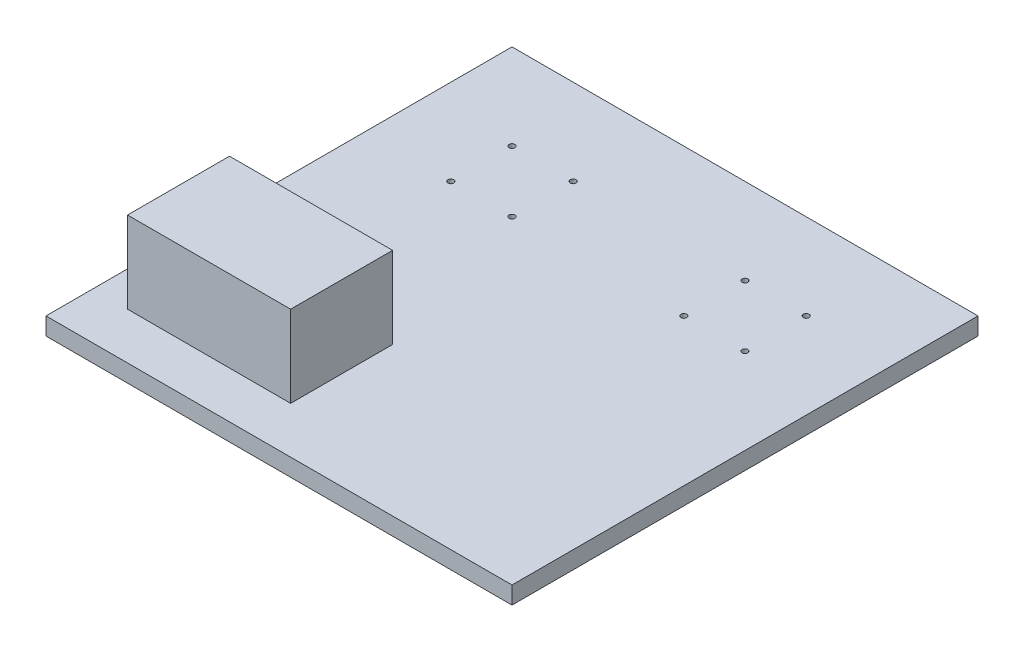
ISO-10303-21;
HEADER;
FILE_DESCRIPTION(('STEP AP214'),'2;1');
FILE_NAME('part.step','',(''),(''),'','','');
FILE_SCHEMA(('AUTOMOTIVE_DESIGN { 1 0 10303 214 1 1 1 1 }'));
ENDSEC;
DATA;
#1=APPLICATION_CONTEXT('core data for automotive mechanical design processes');
#2=APPLICATION_PROTOCOL_DEFINITION('international standard','automotive_design',2000,#1);
#3=PRODUCT_CONTEXT('',#1,'mechanical');
#4=PRODUCT('Part','Part','',(#3));
#5=PRODUCT_RELATED_PRODUCT_CATEGORY('part','',(#4));
#6=PRODUCT_DEFINITION_FORMATION('','',#4);
#7=PRODUCT_DEFINITION_CONTEXT('part definition',#1,'design');
#8=PRODUCT_DEFINITION('design','',#6,#7);
#9=PRODUCT_DEFINITION_SHAPE('','',#8);
#10=(LENGTH_UNIT() NAMED_UNIT(*) SI_UNIT(.MILLI.,.METRE.));
#11=(NAMED_UNIT(*) PLANE_ANGLE_UNIT() SI_UNIT($,.RADIAN.));
#12=(NAMED_UNIT(*) SI_UNIT($,.STERADIAN.) SOLID_ANGLE_UNIT());
#13=UNCERTAINTY_MEASURE_WITH_UNIT(LENGTH_MEASURE(1.E-05),#10,'distance_accuracy_value','');
#14=(GEOMETRIC_REPRESENTATION_CONTEXT(3) GLOBAL_UNCERTAINTY_ASSIGNED_CONTEXT((#13)) GLOBAL_UNIT_ASSIGNED_CONTEXT((#10,
#11,#12)) REPRESENTATION_CONTEXT('',''));
#15=CARTESIAN_POINT('',(0.,0.,0.));
#16=DIRECTION('',(0.,0.,1.));
#17=DIRECTION('',(1.,0.,0.));
#18=AXIS2_PLACEMENT_3D('',#15,#16,#17);
#19=CARTESIAN_POINT('',(0.,6.,0.));
#20=DIRECTION('',(0.,1.,0.));
#21=DIRECTION('',(0.,0.,1.));
#22=AXIS2_PLACEMENT_3D('',#19,#20,#21);
#23=PLANE('',#22);
#24=DIRECTION('',(-1.,0.,0.));
#25=VECTOR('',#24,1.);
#26=CARTESIAN_POINT('',(-40.,6.,120.));
#27=LINE('',#26,#25);
#28=CARTESIAN_POINT('',(120.,6.,120.));
#29=VERTEX_POINT('',#28);
#30=CARTESIAN_POINT('',(-40.,6.,120.));
#31=VERTEX_POINT('',#30);
#32=EDGE_CURVE('E196',#29,#31,#27,.T.);
#33=ORIENTED_EDGE('',*,*,#32,.F.);
#34=DIRECTION('',(0.,0.,1.));
#35=VECTOR('',#34,1.);
#36=CARTESIAN_POINT('',(120.,6.,-40.));
#37=LINE('',#36,#35);
#38=CARTESIAN_POINT('',(120.,6.,-40.));
#39=VERTEX_POINT('',#38);
#40=EDGE_CURVE('E229',#39,#29,#37,.T.);
#41=ORIENTED_EDGE('',*,*,#40,.F.);
#42=DIRECTION('',(-1.,0.,0.));
#43=VECTOR('',#42,1.);
#44=CARTESIAN_POINT('',(-40.,6.,-40.));
#45=LINE('',#44,#43);
#46=CARTESIAN_POINT('',(-40.,6.,-40.));
#47=VERTEX_POINT('',#46);
#48=EDGE_CURVE('E45',#39,#47,#45,.T.);
#49=ORIENTED_EDGE('',*,*,#48,.T.);
#50=DIRECTION('',(0.,0.,1.));
#51=VECTOR('',#50,1.);
#52=CARTESIAN_POINT('',(-40.,6.,-40.));
#53=LINE('',#52,#51);
#54=EDGE_CURVE('E260',#47,#31,#53,.T.);
#55=ORIENTED_EDGE('',*,*,#54,.T.);
#56=EDGE_LOOP('',(#33,#41,#49,#55));
#57=FACE_BOUND('',#56,.T.);
#58=CARTESIAN_POINT('',(90.4999999999998,6.,10.5));
#59=DIRECTION('',(0.,-1.,0.));
#60=DIRECTION('',(0.,0.,1.));
#61=AXIS2_PLACEMENT_3D('',#58,#59,#60);
#62=CIRCLE('',#61,0.999999999999999);
#63=CARTESIAN_POINT('',(90.4999999999998,6.,11.5));
#64=VERTEX_POINT('',#63);
#65=EDGE_CURVE('E204',#64,#64,#62,.T.);
#66=ORIENTED_EDGE('',*,*,#65,.T.);
#67=EDGE_LOOP('',(#66));
#68=FACE_BOUND('',#67,.T.);
#69=CARTESIAN_POINT('',(69.4999999999998,6.,10.5));
#70=DIRECTION('',(0.,-1.,0.));
#71=DIRECTION('',(0.,0.,1.));
#72=AXIS2_PLACEMENT_3D('',#69,#70,#71);
#73=CIRCLE('',#72,0.999999999999999);
#74=CARTESIAN_POINT('',(69.4999999999998,6.,11.5));
#75=VERTEX_POINT('',#74);
#76=EDGE_CURVE('E215',#75,#75,#73,.T.);
#77=ORIENTED_EDGE('',*,*,#76,.T.);
#78=EDGE_LOOP('',(#77));
#79=FACE_BOUND('',#78,.T.);
#80=CARTESIAN_POINT('',(69.5,6.,-10.5));
#81=DIRECTION('',(0.,-1.,0.));
#82=DIRECTION('',(0.,0.,1.));
#83=AXIS2_PLACEMENT_3D('',#80,#81,#82);
#84=CIRCLE('',#83,0.999999999999999);
#85=CARTESIAN_POINT('',(69.5,6.,-9.5));
#86=VERTEX_POINT('',#85);
#87=EDGE_CURVE('E209',#86,#86,#84,.T.);
#88=ORIENTED_EDGE('',*,*,#87,.T.);
#89=EDGE_LOOP('',(#88));
#90=FACE_BOUND('',#89,.T.);
#91=CARTESIAN_POINT('',(90.5,6.,-10.5));
#92=DIRECTION('',(0.,-1.,0.));
#93=DIRECTION('',(0.,0.,1.));
#94=AXIS2_PLACEMENT_3D('',#91,#92,#93);
#95=CIRCLE('',#94,0.999999999999999);
#96=CARTESIAN_POINT('',(90.5,6.,-9.5));
#97=VERTEX_POINT('',#96);
#98=EDGE_CURVE('E208',#97,#97,#95,.T.);
#99=ORIENTED_EDGE('',*,*,#98,.T.);
#100=EDGE_LOOP('',(#99));
#101=FACE_BOUND('',#100,.T.);
#102=CARTESIAN_POINT('',(-10.4999999999998,6.,10.5));
#103=DIRECTION('',(0.,1.,0.));
#104=DIRECTION('',(0.,0.,1.));
#105=AXIS2_PLACEMENT_3D('',#102,#103,#104);
#106=CIRCLE('',#105,0.999999999999999);
#107=CARTESIAN_POINT('',(-10.4999999999998,6.,11.5));
#108=VERTEX_POINT('',#107);
#109=EDGE_CURVE('E249',#108,#108,#106,.T.);
#110=ORIENTED_EDGE('',*,*,#109,.F.);
#111=EDGE_LOOP('',(#110));
#112=FACE_BOUND('',#111,.T.);
#113=CARTESIAN_POINT('',(10.5000000000002,6.,10.5));
#114=DIRECTION('',(0.,1.,0.));
#115=DIRECTION('',(0.,0.,1.));
#116=AXIS2_PLACEMENT_3D('',#113,#114,#115);
#117=CIRCLE('',#116,0.999999999999999);
#118=CARTESIAN_POINT('',(10.5000000000002,6.,11.5));
#119=VERTEX_POINT('',#118);
#120=EDGE_CURVE('E243',#119,#119,#117,.T.);
#121=ORIENTED_EDGE('',*,*,#120,.F.);
#122=EDGE_LOOP('',(#121));
#123=FACE_BOUND('',#122,.T.);
#124=CARTESIAN_POINT('',(10.5,6.,-10.5));
#125=DIRECTION('',(0.,1.,0.));
#126=DIRECTION('',(0.,0.,1.));
#127=AXIS2_PLACEMENT_3D('',#124,#125,#126);
#128=CIRCLE('',#127,0.999999999999999);
#129=CARTESIAN_POINT('',(10.5,6.,-9.5));
#130=VERTEX_POINT('',#129);
#131=EDGE_CURVE('E236',#130,#130,#128,.T.);
#132=ORIENTED_EDGE('',*,*,#131,.F.);
#133=EDGE_LOOP('',(#132));
#134=FACE_BOUND('',#133,.T.);
#135=CARTESIAN_POINT('',(-10.5,6.,-10.5));
#136=DIRECTION('',(0.,1.,0.));
#137=DIRECTION('',(0.,0.,1.));
#138=AXIS2_PLACEMENT_3D('',#135,#136,#137);
#139=CIRCLE('',#138,0.999999999999999);
#140=CARTESIAN_POINT('',(-10.5,6.,-9.5));
#141=VERTEX_POINT('',#140);
#142=EDGE_CURVE('E239',#141,#141,#139,.T.);
#143=ORIENTED_EDGE('',*,*,#142,.F.);
#144=EDGE_LOOP('',(#143));
#145=FACE_BOUND('',#144,.T.);
#146=DIRECTION('',(1.,0.,0.));
#147=VECTOR('',#146,1.);
#148=CARTESIAN_POINT('',(-28.,6.,104.));
#149=LINE('',#148,#147);
#150=CARTESIAN_POINT('',(-28.,6.,104.));
#151=VERTEX_POINT('',#150);
#152=CARTESIAN_POINT('',(28.,6.,104.));
#153=VERTEX_POINT('',#152);
#154=EDGE_CURVE('E178',#151,#153,#149,.T.);
#155=ORIENTED_EDGE('',*,*,#154,.F.);
#156=DIRECTION('',(0.,0.,1.));
#157=VECTOR('',#156,1.);
#158=CARTESIAN_POINT('',(-28.,6.,69.));
#159=LINE('',#158,#157);
#160=CARTESIAN_POINT('',(-28.,6.,69.));
#161=VERTEX_POINT('',#160);
#162=EDGE_CURVE('E161',#161,#151,#159,.T.);
#163=ORIENTED_EDGE('',*,*,#162,.F.);
#164=DIRECTION('',(-1.,0.,0.));
#165=VECTOR('',#164,1.);
#166=CARTESIAN_POINT('',(-28.,6.,69.));
#167=LINE('',#166,#165);
#168=CARTESIAN_POINT('',(-24.,6.,69.));
#169=VERTEX_POINT('',#168);
#170=EDGE_CURVE('E182',#169,#161,#167,.T.);
#171=ORIENTED_EDGE('',*,*,#170,.F.);
#172=DIRECTION('',(0.,0.,-1.));
#173=VECTOR('',#172,1.);
#174=CARTESIAN_POINT('',(-24.,6.,100.));
#175=LINE('',#174,#173);
#176=CARTESIAN_POINT('',(-24.,6.,100.));
#177=VERTEX_POINT('',#176);
#178=EDGE_CURVE('E134',#177,#169,#175,.T.);
#179=ORIENTED_EDGE('',*,*,#178,.F.);
#180=DIRECTION('',(-1.,0.,0.));
#181=VECTOR('',#180,1.);
#182=CARTESIAN_POINT('',(24.,6.,100.));
#183=LINE('',#182,#181);
#184=CARTESIAN_POINT('',(24.,6.,100.));
#185=VERTEX_POINT('',#184);
#186=EDGE_CURVE('E138',#185,#177,#183,.T.);
#187=ORIENTED_EDGE('',*,*,#186,.F.);
#188=DIRECTION('',(0.,0.,-1.));
#189=VECTOR('',#188,1.);
#190=CARTESIAN_POINT('',(24.,6.,100.));
#191=LINE('',#190,#189);
#192=CARTESIAN_POINT('',(24.,6.,69.));
#193=VERTEX_POINT('',#192);
#194=EDGE_CURVE('E126',#185,#193,#191,.T.);
#195=ORIENTED_EDGE('',*,*,#194,.T.);
#196=CARTESIAN_POINT('',(28.,6.,69.));
#197=VERTEX_POINT('',#196);
#198=EDGE_CURVE('E169',#197,#193,#167,.T.);
#199=ORIENTED_EDGE('',*,*,#198,.F.);
#200=DIRECTION('',(0.,0.,-1.));
#201=VECTOR('',#200,1.);
#202=CARTESIAN_POINT('',(28.,6.,69.));
#203=LINE('',#202,#201);
#204=EDGE_CURVE('E180',#153,#197,#203,.T.);
#205=ORIENTED_EDGE('',*,*,#204,.F.);
#206=EDGE_LOOP('',(#155,#163,#171,#179,#187,#195,#199,#205));
#207=FACE_BOUND('',#206,.T.);
#208=ADVANCED_FACE('F37',(#57,#68,#79,#90,#101,#112,#123,#134,#145,#207),#23,.T.);
#209=CARTESIAN_POINT('',(-40.,6.,-40.));
#210=DIRECTION('',(1.,0.,0.));
#211=DIRECTION('',(0.,0.,-1.));
#212=AXIS2_PLACEMENT_3D('',#209,#210,#211);
#213=PLANE('',#212);
#214=DIRECTION('',(0.,0.,1.));
#215=VECTOR('',#214,1.);
#216=CARTESIAN_POINT('',(-40.,0.,-40.));
#217=LINE('',#216,#215);
#218=CARTESIAN_POINT('',(-40.,0.,-40.));
#219=VERTEX_POINT('',#218);
#220=CARTESIAN_POINT('',(-40.,0.,120.));
#221=VERTEX_POINT('',#220);
#222=EDGE_CURVE('E257',#219,#221,#217,.T.);
#223=ORIENTED_EDGE('',*,*,#222,.T.);
#224=DIRECTION('',(0.,-1.,0.));
#225=VECTOR('',#224,1.);
#226=CARTESIAN_POINT('',(-40.,6.,120.));
#227=LINE('',#226,#225);
#228=EDGE_CURVE('E199',#31,#221,#227,.T.);
#229=ORIENTED_EDGE('',*,*,#228,.F.);
#230=ORIENTED_EDGE('',*,*,#54,.F.);
#231=DIRECTION('',(0.,-1.,0.));
#232=VECTOR('',#231,1.);
#233=CARTESIAN_POINT('',(-40.,6.,-40.));
#234=LINE('',#233,#232);
#235=EDGE_CURVE('E11',#47,#219,#234,.T.);
#236=ORIENTED_EDGE('',*,*,#235,.T.);
#237=EDGE_LOOP('',(#223,#229,#230,#236));
#238=FACE_BOUND('',#237,.T.);
#239=ADVANCED_FACE('F39',(#238),#213,.F.);
#240=CARTESIAN_POINT('',(-40.,6.,-40.));
#241=DIRECTION('',(0.,0.,1.));
#242=DIRECTION('',(1.,0.,0.));
#243=AXIS2_PLACEMENT_3D('',#240,#241,#242);
#244=PLANE('',#243);
#245=DIRECTION('',(-1.,0.,0.));
#246=VECTOR('',#245,1.);
#247=CARTESIAN_POINT('',(-40.,0.,-40.));
#248=LINE('',#247,#246);
#249=CARTESIAN_POINT('',(120.,0.,-40.));
#250=VERTEX_POINT('',#249);
#251=EDGE_CURVE('E262',#250,#219,#248,.T.);
#252=ORIENTED_EDGE('',*,*,#251,.T.);
#253=ORIENTED_EDGE('',*,*,#235,.F.);
#254=ORIENTED_EDGE('',*,*,#48,.F.);
#255=DIRECTION('',(0.,-1.,0.));
#256=VECTOR('',#255,1.);
#257=CARTESIAN_POINT('',(120.,6.,-40.));
#258=LINE('',#257,#256);
#259=EDGE_CURVE('E231',#39,#250,#258,.T.);
#260=ORIENTED_EDGE('',*,*,#259,.T.);
#261=EDGE_LOOP('',(#252,#253,#254,#260));
#262=FACE_BOUND('',#261,.T.);
#263=ADVANCED_FACE('F266',(#262),#244,.F.);
#264=CARTESIAN_POINT('',(0.,0.,0.));
#265=DIRECTION('',(0.,1.,0.));
#266=DIRECTION('',(0.,0.,1.));
#267=AXIS2_PLACEMENT_3D('',#264,#265,#266);
#268=PLANE('',#267);
#269=DIRECTION('',(0.,0.,1.));
#270=VECTOR('',#269,1.);
#271=CARTESIAN_POINT('',(120.,0.,-40.));
#272=LINE('',#271,#270);
#273=CARTESIAN_POINT('',(120.,0.,120.));
#274=VERTEX_POINT('',#273);
#275=EDGE_CURVE('E226',#250,#274,#272,.T.);
#276=ORIENTED_EDGE('',*,*,#275,.T.);
#277=DIRECTION('',(-1.,0.,0.));
#278=VECTOR('',#277,1.);
#279=CARTESIAN_POINT('',(-40.,0.,120.));
#280=LINE('',#279,#278);
#281=EDGE_CURVE('E195',#274,#221,#280,.T.);
#282=ORIENTED_EDGE('',*,*,#281,.T.);
#283=ORIENTED_EDGE('',*,*,#222,.F.);
#284=ORIENTED_EDGE('',*,*,#251,.F.);
#285=EDGE_LOOP('',(#276,#282,#283,#284));
#286=FACE_BOUND('',#285,.T.);
#287=CARTESIAN_POINT('',(90.4999999999998,0.,10.5));
#288=DIRECTION('',(0.,-1.,0.));
#289=DIRECTION('',(0.,0.,1.));
#290=AXIS2_PLACEMENT_3D('',#287,#288,#289);
#291=CIRCLE('',#290,0.999999999999999);
#292=CARTESIAN_POINT('',(90.4999999999998,0.,11.5));
#293=VERTEX_POINT('',#292);
#294=EDGE_CURVE('E218',#293,#293,#291,.T.);
#295=ORIENTED_EDGE('',*,*,#294,.F.);
#296=EDGE_LOOP('',(#295));
#297=FACE_BOUND('',#296,.T.);
#298=CARTESIAN_POINT('',(69.4999999999998,0.,10.5));
#299=DIRECTION('',(0.,-1.,0.));
#300=DIRECTION('',(0.,0.,1.));
#301=AXIS2_PLACEMENT_3D('',#298,#299,#300);
#302=CIRCLE('',#301,0.999999999999999);
#303=CARTESIAN_POINT('',(69.4999999999998,0.,11.5));
#304=VERTEX_POINT('',#303);
#305=EDGE_CURVE('E212',#304,#304,#302,.T.);
#306=ORIENTED_EDGE('',*,*,#305,.F.);
#307=EDGE_LOOP('',(#306));
#308=FACE_BOUND('',#307,.T.);
#309=CARTESIAN_POINT('',(69.5,0.,-10.5));
#310=DIRECTION('',(0.,-1.,0.));
#311=DIRECTION('',(0.,0.,1.));
#312=AXIS2_PLACEMENT_3D('',#309,#310,#311);
#313=CIRCLE('',#312,0.999999999999999);
#314=CARTESIAN_POINT('',(69.5,0.,-9.5));
#315=VERTEX_POINT('',#314);
#316=EDGE_CURVE('E205',#315,#315,#313,.T.);
#317=ORIENTED_EDGE('',*,*,#316,.F.);
#318=EDGE_LOOP('',(#317));
#319=FACE_BOUND('',#318,.T.);
#320=CARTESIAN_POINT('',(90.5,0.,-10.5));
#321=DIRECTION('',(0.,-1.,0.));
#322=DIRECTION('',(0.,0.,1.));
#323=AXIS2_PLACEMENT_3D('',#320,#321,#322);
#324=CIRCLE('',#323,0.999999999999999);
#325=CARTESIAN_POINT('',(90.5,0.,-9.5));
#326=VERTEX_POINT('',#325);
#327=EDGE_CURVE('E223',#326,#326,#324,.T.);
#328=ORIENTED_EDGE('',*,*,#327,.F.);
#329=EDGE_LOOP('',(#328));
#330=FACE_BOUND('',#329,.T.);
#331=CARTESIAN_POINT('',(-10.4999999999998,0.,10.5));
#332=DIRECTION('',(0.,1.,0.));
#333=DIRECTION('',(0.,0.,1.));
#334=AXIS2_PLACEMENT_3D('',#331,#332,#333);
#335=CIRCLE('',#334,0.999999999999999);
#336=CARTESIAN_POINT('',(-10.4999999999998,0.,11.5));
#337=VERTEX_POINT('',#336);
#338=EDGE_CURVE('E235',#337,#337,#335,.T.);
#339=ORIENTED_EDGE('',*,*,#338,.T.);
#340=EDGE_LOOP('',(#339));
#341=FACE_BOUND('',#340,.T.);
#342=CARTESIAN_POINT('',(10.5000000000002,0.,10.5));
#343=DIRECTION('',(0.,1.,0.));
#344=DIRECTION('',(0.,0.,1.));
#345=AXIS2_PLACEMENT_3D('',#342,#343,#344);
#346=CIRCLE('',#345,0.999999999999999);
#347=CARTESIAN_POINT('',(10.5000000000002,0.,11.5));
#348=VERTEX_POINT('',#347);
#349=EDGE_CURVE('E246',#348,#348,#346,.T.);
#350=ORIENTED_EDGE('',*,*,#349,.T.);
#351=EDGE_LOOP('',(#350));
#352=FACE_BOUND('',#351,.T.);
#353=CARTESIAN_POINT('',(10.5,0.,-10.5));
#354=DIRECTION('',(0.,1.,0.));
#355=DIRECTION('',(0.,0.,1.));
#356=AXIS2_PLACEMENT_3D('',#353,#354,#355);
#357=CIRCLE('',#356,0.999999999999999);
#358=CARTESIAN_POINT('',(10.5,0.,-9.5));
#359=VERTEX_POINT('',#358);
#360=EDGE_CURVE('E240',#359,#359,#357,.T.);
#361=ORIENTED_EDGE('',*,*,#360,.T.);
#362=EDGE_LOOP('',(#361));
#363=FACE_BOUND('',#362,.T.);
#364=CARTESIAN_POINT('',(-10.5,0.,-10.5));
#365=DIRECTION('',(0.,1.,0.));
#366=DIRECTION('',(0.,0.,1.));
#367=AXIS2_PLACEMENT_3D('',#364,#365,#366);
#368=CIRCLE('',#367,0.999999999999999);
#369=CARTESIAN_POINT('',(-10.5,0.,-9.5));
#370=VERTEX_POINT('',#369);
#371=EDGE_CURVE('E254',#370,#370,#368,.T.);
#372=ORIENTED_EDGE('',*,*,#371,.T.);
#373=EDGE_LOOP('',(#372));
#374=FACE_BOUND('',#373,.T.);
#375=ADVANCED_FACE('F274',(#286,#297,#308,#319,#330,#341,#352,#363,#374),#268,.F.);
#376=CARTESIAN_POINT('',(-10.5,0.,-10.5));
#377=DIRECTION('',(0.,1.,0.));
#378=DIRECTION('',(0.,0.,1.));
#379=AXIS2_PLACEMENT_3D('',#376,#377,#378);
#380=CYLINDRICAL_SURFACE('',#379,0.999999999999999);
#381=ORIENTED_EDGE('',*,*,#371,.F.);
#382=EDGE_LOOP('',(#381));
#383=FACE_BOUND('',#382,.T.);
#384=ORIENTED_EDGE('',*,*,#142,.T.);
#385=EDGE_LOOP('',(#384));
#386=FACE_BOUND('',#385,.T.);
#387=ADVANCED_FACE('F304',(#383,#386),#380,.F.);
#388=CARTESIAN_POINT('',(10.5,0.,-10.5));
#389=DIRECTION('',(0.,1.,0.));
#390=DIRECTION('',(0.,0.,1.));
#391=AXIS2_PLACEMENT_3D('',#388,#389,#390);
#392=CYLINDRICAL_SURFACE('',#391,0.999999999999999);
#393=ORIENTED_EDGE('',*,*,#360,.F.);
#394=EDGE_LOOP('',(#393));
#395=FACE_BOUND('',#394,.T.);
#396=ORIENTED_EDGE('',*,*,#131,.T.);
#397=EDGE_LOOP('',(#396));
#398=FACE_BOUND('',#397,.T.);
#399=ADVANCED_FACE('F306',(#395,#398),#392,.F.);
#400=CARTESIAN_POINT('',(10.5000000000002,0.,10.5));
#401=DIRECTION('',(0.,1.,0.));
#402=DIRECTION('',(0.,0.,1.));
#403=AXIS2_PLACEMENT_3D('',#400,#401,#402);
#404=CYLINDRICAL_SURFACE('',#403,0.999999999999999);
#405=ORIENTED_EDGE('',*,*,#349,.F.);
#406=EDGE_LOOP('',(#405));
#407=FACE_BOUND('',#406,.T.);
#408=ORIENTED_EDGE('',*,*,#120,.T.);
#409=EDGE_LOOP('',(#408));
#410=FACE_BOUND('',#409,.T.);
#411=ADVANCED_FACE('F313',(#407,#410),#404,.F.);
#412=CARTESIAN_POINT('',(-10.4999999999998,0.,10.5));
#413=DIRECTION('',(0.,1.,0.));
#414=DIRECTION('',(0.,0.,1.));
#415=AXIS2_PLACEMENT_3D('',#412,#413,#414);
#416=CYLINDRICAL_SURFACE('',#415,0.999999999999999);
#417=ORIENTED_EDGE('',*,*,#338,.F.);
#418=EDGE_LOOP('',(#417));
#419=FACE_BOUND('',#418,.T.);
#420=ORIENTED_EDGE('',*,*,#109,.T.);
#421=EDGE_LOOP('',(#420));
#422=FACE_BOUND('',#421,.T.);
#423=ADVANCED_FACE('F319',(#419,#422),#416,.F.);
#424=CARTESIAN_POINT('',(120.,6.,-40.));
#425=DIRECTION('',(1.,0.,0.));
#426=DIRECTION('',(0.,0.,-1.));
#427=AXIS2_PLACEMENT_3D('',#424,#425,#426);
#428=PLANE('',#427);
#429=ORIENTED_EDGE('',*,*,#275,.F.);
#430=ORIENTED_EDGE('',*,*,#259,.F.);
#431=ORIENTED_EDGE('',*,*,#40,.T.);
#432=DIRECTION('',(0.,-1.,0.));
#433=VECTOR('',#432,1.);
#434=CARTESIAN_POINT('',(120.,6.,120.));
#435=LINE('',#434,#433);
#436=EDGE_CURVE('E192',#29,#274,#435,.T.);
#437=ORIENTED_EDGE('',*,*,#436,.T.);
#438=EDGE_LOOP('',(#429,#430,#431,#437));
#439=FACE_BOUND('',#438,.T.);
#440=ADVANCED_FACE('F281',(#439),#428,.T.);
#441=CARTESIAN_POINT('',(90.5,0.,-10.5));
#442=DIRECTION('',(0.,1.,0.));
#443=DIRECTION('',(0.,0.,1.));
#444=AXIS2_PLACEMENT_3D('',#441,#442,#443);
#445=CYLINDRICAL_SURFACE('',#444,0.999999999999999);
#446=ORIENTED_EDGE('',*,*,#327,.T.);
#447=EDGE_LOOP('',(#446));
#448=FACE_BOUND('',#447,.T.);
#449=ORIENTED_EDGE('',*,*,#98,.F.);
#450=EDGE_LOOP('',(#449));
#451=FACE_BOUND('',#450,.T.);
#452=ADVANCED_FACE('F474',(#448,#451),#445,.F.);
#453=CARTESIAN_POINT('',(69.5,0.,-10.5));
#454=DIRECTION('',(0.,1.,0.));
#455=DIRECTION('',(0.,0.,1.));
#456=AXIS2_PLACEMENT_3D('',#453,#454,#455);
#457=CYLINDRICAL_SURFACE('',#456,0.999999999999999);
#458=ORIENTED_EDGE('',*,*,#316,.T.);
#459=EDGE_LOOP('',(#458));
#460=FACE_BOUND('',#459,.T.);
#461=ORIENTED_EDGE('',*,*,#87,.F.);
#462=EDGE_LOOP('',(#461));
#463=FACE_BOUND('',#462,.T.);
#464=ADVANCED_FACE('F464',(#460,#463),#457,.F.);
#465=CARTESIAN_POINT('',(69.4999999999998,0.,10.5));
#466=DIRECTION('',(0.,1.,0.));
#467=DIRECTION('',(0.,0.,1.));
#468=AXIS2_PLACEMENT_3D('',#465,#466,#467);
#469=CYLINDRICAL_SURFACE('',#468,0.999999999999999);
#470=ORIENTED_EDGE('',*,*,#305,.T.);
#471=EDGE_LOOP('',(#470));
#472=FACE_BOUND('',#471,.T.);
#473=ORIENTED_EDGE('',*,*,#76,.F.);
#474=EDGE_LOOP('',(#473));
#475=FACE_BOUND('',#474,.T.);
#476=ADVANCED_FACE('F455',(#472,#475),#469,.F.);
#477=CARTESIAN_POINT('',(90.4999999999998,0.,10.5));
#478=DIRECTION('',(0.,1.,0.));
#479=DIRECTION('',(0.,0.,1.));
#480=AXIS2_PLACEMENT_3D('',#477,#478,#479);
#481=CYLINDRICAL_SURFACE('',#480,0.999999999999999);
#482=ORIENTED_EDGE('',*,*,#294,.T.);
#483=EDGE_LOOP('',(#482));
#484=FACE_BOUND('',#483,.T.);
#485=ORIENTED_EDGE('',*,*,#65,.F.);
#486=EDGE_LOOP('',(#485));
#487=FACE_BOUND('',#486,.T.);
#488=ADVANCED_FACE('F444',(#484,#487),#481,.F.);
#489=CARTESIAN_POINT('',(-40.,6.,120.));
#490=DIRECTION('',(0.,0.,1.));
#491=DIRECTION('',(1.,0.,0.));
#492=AXIS2_PLACEMENT_3D('',#489,#490,#491);
#493=PLANE('',#492);
#494=ORIENTED_EDGE('',*,*,#281,.F.);
#495=ORIENTED_EDGE('',*,*,#436,.F.);
#496=ORIENTED_EDGE('',*,*,#32,.T.);
#497=ORIENTED_EDGE('',*,*,#228,.T.);
#498=EDGE_LOOP('',(#494,#495,#496,#497));
#499=FACE_BOUND('',#498,.T.);
#500=ADVANCED_FACE('F279',(#499),#493,.T.);
#501=CARTESIAN_POINT('',(-28.,34.,69.));
#502=DIRECTION('',(1.,0.,0.));
#503=DIRECTION('',(0.,0.,-1.));
#504=AXIS2_PLACEMENT_3D('',#501,#502,#503);
#505=PLANE('',#504);
#506=ORIENTED_EDGE('',*,*,#162,.T.);
#507=DIRECTION('',(0.,-1.,0.));
#508=VECTOR('',#507,1.);
#509=CARTESIAN_POINT('',(-28.,34.,104.));
#510=LINE('',#509,#508);
#511=CARTESIAN_POINT('',(-28.,34.,104.));
#512=VERTEX_POINT('',#511);
#513=EDGE_CURVE('E190',#512,#151,#510,.T.);
#514=ORIENTED_EDGE('',*,*,#513,.F.);
#515=DIRECTION('',(0.,0.,1.));
#516=VECTOR('',#515,1.);
#517=CARTESIAN_POINT('',(-28.,34.,69.));
#518=LINE('',#517,#516);
#519=CARTESIAN_POINT('',(-28.,34.,69.));
#520=VERTEX_POINT('',#519);
#521=EDGE_CURVE('E165',#520,#512,#518,.T.);
#522=ORIENTED_EDGE('',*,*,#521,.F.);
#523=DIRECTION('',(0.,-1.,0.));
#524=VECTOR('',#523,1.);
#525=CARTESIAN_POINT('',(-28.,34.,69.));
#526=LINE('',#525,#524);
#527=EDGE_CURVE('E175',#520,#161,#526,.T.);
#528=ORIENTED_EDGE('',*,*,#527,.T.);
#529=EDGE_LOOP('',(#506,#514,#522,#528));
#530=FACE_BOUND('',#529,.T.);
#531=ADVANCED_FACE('F420',(#530),#505,.F.);
#532=CARTESIAN_POINT('',(-28.,34.,104.));
#533=DIRECTION('',(0.,0.,-1.));
#534=DIRECTION('',(-1.,0.,0.));
#535=AXIS2_PLACEMENT_3D('',#532,#533,#534);
#536=PLANE('',#535);
#537=ORIENTED_EDGE('',*,*,#154,.T.);
#538=DIRECTION('',(0.,-1.,0.));
#539=VECTOR('',#538,1.);
#540=CARTESIAN_POINT('',(28.,34.,104.));
#541=LINE('',#540,#539);
#542=CARTESIAN_POINT('',(28.,34.,104.));
#543=VERTEX_POINT('',#542);
#544=EDGE_CURVE('E187',#543,#153,#541,.T.);
#545=ORIENTED_EDGE('',*,*,#544,.F.);
#546=DIRECTION('',(1.,0.,0.));
#547=VECTOR('',#546,1.);
#548=CARTESIAN_POINT('',(-28.,34.,104.));
#549=LINE('',#548,#547);
#550=EDGE_CURVE('E168',#512,#543,#549,.T.);
#551=ORIENTED_EDGE('',*,*,#550,.F.);
#552=ORIENTED_EDGE('',*,*,#513,.T.);
#553=EDGE_LOOP('',(#537,#545,#551,#552));
#554=FACE_BOUND('',#553,.T.);
#555=ADVANCED_FACE('F411',(#554),#536,.F.);
#556=CARTESIAN_POINT('',(28.,34.,69.));
#557=DIRECTION('',(-1.,0.,0.));
#558=DIRECTION('',(0.,0.,1.));
#559=AXIS2_PLACEMENT_3D('',#556,#557,#558);
#560=PLANE('',#559);
#561=ORIENTED_EDGE('',*,*,#204,.T.);
#562=DIRECTION('',(0.,-1.,0.));
#563=VECTOR('',#562,1.);
#564=CARTESIAN_POINT('',(28.,34.,69.));
#565=LINE('',#564,#563);
#566=CARTESIAN_POINT('',(28.,34.,69.));
#567=VERTEX_POINT('',#566);
#568=EDGE_CURVE('E60',#567,#197,#565,.T.);
#569=ORIENTED_EDGE('',*,*,#568,.F.);
#570=DIRECTION('',(0.,0.,-1.));
#571=VECTOR('',#570,1.);
#572=CARTESIAN_POINT('',(28.,34.,69.));
#573=LINE('',#572,#571);
#574=EDGE_CURVE('E171',#543,#567,#573,.T.);
#575=ORIENTED_EDGE('',*,*,#574,.F.);
#576=ORIENTED_EDGE('',*,*,#544,.T.);
#577=EDGE_LOOP('',(#561,#569,#575,#576));
#578=FACE_BOUND('',#577,.T.);
#579=ADVANCED_FACE('F351',(#578),#560,.F.);
#580=CARTESIAN_POINT('',(-28.,34.,69.));
#581=DIRECTION('',(0.,0.,1.));
#582=DIRECTION('',(1.,0.,0.));
#583=AXIS2_PLACEMENT_3D('',#580,#581,#582);
#584=PLANE('',#583);
#585=ORIENTED_EDGE('',*,*,#198,.T.);
#586=DIRECTION('',(0.,-1.,0.));
#587=VECTOR('',#586,1.);
#588=CARTESIAN_POINT('',(24.,30.,69.));
#589=LINE('',#588,#587);
#590=CARTESIAN_POINT('',(24.,30.,69.));
#591=VERTEX_POINT('',#590);
#592=EDGE_CURVE('E52',#591,#193,#589,.T.);
#593=ORIENTED_EDGE('',*,*,#592,.F.);
#594=DIRECTION('',(1.,0.,0.));
#595=VECTOR('',#594,1.);
#596=CARTESIAN_POINT('',(24.,30.,69.));
#597=LINE('',#596,#595);
#598=CARTESIAN_POINT('',(-24.,30.,69.));
#599=VERTEX_POINT('',#598);
#600=EDGE_CURVE('E148',#599,#591,#597,.T.);
#601=ORIENTED_EDGE('',*,*,#600,.F.);
#602=DIRECTION('',(0.,1.,0.));
#603=VECTOR('',#602,1.);
#604=CARTESIAN_POINT('',(-24.,30.,69.));
#605=LINE('',#604,#603);
#606=EDGE_CURVE('E151',#169,#599,#605,.T.);
#607=ORIENTED_EDGE('',*,*,#606,.F.);
#608=ORIENTED_EDGE('',*,*,#170,.T.);
#609=ORIENTED_EDGE('',*,*,#527,.F.);
#610=DIRECTION('',(-1.,0.,0.));
#611=VECTOR('',#610,1.);
#612=CARTESIAN_POINT('',(-28.,34.,69.));
#613=LINE('',#612,#611);
#614=EDGE_CURVE('E173',#567,#520,#613,.T.);
#615=ORIENTED_EDGE('',*,*,#614,.F.);
#616=ORIENTED_EDGE('',*,*,#568,.T.);
#617=EDGE_LOOP('',(#585,#593,#601,#607,#608,#609,#615,#616));
#618=FACE_BOUND('',#617,.T.);
#619=ADVANCED_FACE('F346',(#618),#584,.F.);
#620=CARTESIAN_POINT('',(0.,34.,0.));
#621=DIRECTION('',(0.,1.,0.));
#622=DIRECTION('',(0.,0.,1.));
#623=AXIS2_PLACEMENT_3D('',#620,#621,#622);
#624=PLANE('',#623);
#625=ORIENTED_EDGE('',*,*,#521,.T.);
#626=ORIENTED_EDGE('',*,*,#550,.T.);
#627=ORIENTED_EDGE('',*,*,#574,.T.);
#628=ORIENTED_EDGE('',*,*,#614,.T.);
#629=EDGE_LOOP('',(#625,#626,#627,#628));
#630=FACE_BOUND('',#629,.T.);
#631=ADVANCED_FACE('F342',(#630),#624,.T.);
#632=CARTESIAN_POINT('',(24.,30.,100.));
#633=DIRECTION('',(1.,0.,0.));
#634=DIRECTION('',(0.,1.,0.));
#635=AXIS2_PLACEMENT_3D('',#632,#633,#634);
#636=PLANE('',#635);
#637=ORIENTED_EDGE('',*,*,#592,.T.);
#638=ORIENTED_EDGE('',*,*,#194,.F.);
#639=DIRECTION('',(0.,-1.,0.));
#640=VECTOR('',#639,1.);
#641=CARTESIAN_POINT('',(24.,30.,100.));
#642=LINE('',#641,#640);
#643=CARTESIAN_POINT('',(24.,30.,100.));
#644=VERTEX_POINT('',#643);
#645=EDGE_CURVE('E130',#644,#185,#642,.T.);
#646=ORIENTED_EDGE('',*,*,#645,.F.);
#647=DIRECTION('',(0.,0.,-1.));
#648=VECTOR('',#647,1.);
#649=CARTESIAN_POINT('',(24.,30.,100.));
#650=LINE('',#649,#648);
#651=EDGE_CURVE('E159',#644,#591,#650,.T.);
#652=ORIENTED_EDGE('',*,*,#651,.T.);
#653=EDGE_LOOP('',(#637,#638,#646,#652));
#654=FACE_BOUND('',#653,.T.);
#655=ADVANCED_FACE('F128',(#654),#636,.F.);
#656=CARTESIAN_POINT('',(24.,30.,100.));
#657=DIRECTION('',(0.,1.,0.));
#658=DIRECTION('',(0.,0.,1.));
#659=AXIS2_PLACEMENT_3D('',#656,#657,#658);
#660=PLANE('',#659);
#661=ORIENTED_EDGE('',*,*,#600,.T.);
#662=ORIENTED_EDGE('',*,*,#651,.F.);
#663=DIRECTION('',(1.,0.,0.));
#664=VECTOR('',#663,1.);
#665=CARTESIAN_POINT('',(24.,30.,100.));
#666=LINE('',#665,#664);
#667=CARTESIAN_POINT('',(-24.,30.,100.));
#668=VERTEX_POINT('',#667);
#669=EDGE_CURVE('E135',#668,#644,#666,.T.);
#670=ORIENTED_EDGE('',*,*,#669,.F.);
#671=DIRECTION('',(0.,0.,-1.));
#672=VECTOR('',#671,1.);
#673=CARTESIAN_POINT('',(-24.,30.,100.));
#674=LINE('',#673,#672);
#675=EDGE_CURVE('E162',#668,#599,#674,.T.);
#676=ORIENTED_EDGE('',*,*,#675,.T.);
#677=EDGE_LOOP('',(#661,#662,#670,#676));
#678=FACE_BOUND('',#677,.T.);
#679=ADVANCED_FACE('F362',(#678),#660,.F.);
#680=CARTESIAN_POINT('',(-24.,30.,100.));
#681=DIRECTION('',(-1.,0.,0.));
#682=DIRECTION('',(0.,-1.,0.));
#683=AXIS2_PLACEMENT_3D('',#680,#681,#682);
#684=PLANE('',#683);
#685=ORIENTED_EDGE('',*,*,#606,.T.);
#686=ORIENTED_EDGE('',*,*,#675,.F.);
#687=DIRECTION('',(0.,1.,0.));
#688=VECTOR('',#687,1.);
#689=CARTESIAN_POINT('',(-24.,30.,100.));
#690=LINE('',#689,#688);
#691=EDGE_CURVE('E144',#177,#668,#690,.T.);
#692=ORIENTED_EDGE('',*,*,#691,.F.);
#693=ORIENTED_EDGE('',*,*,#178,.T.);
#694=EDGE_LOOP('',(#685,#686,#692,#693));
#695=FACE_BOUND('',#694,.T.);
#696=ADVANCED_FACE('F372',(#695),#684,.F.);
#697=CARTESIAN_POINT('',(0.,0.,100.));
#698=DIRECTION('',(0.,0.,-1.));
#699=DIRECTION('',(-1.,0.,0.));
#700=AXIS2_PLACEMENT_3D('',#697,#698,#699);
#701=PLANE('',#700);
#702=ORIENTED_EDGE('',*,*,#645,.T.);
#703=ORIENTED_EDGE('',*,*,#186,.T.);
#704=ORIENTED_EDGE('',*,*,#691,.T.);
#705=ORIENTED_EDGE('',*,*,#669,.T.);
#706=EDGE_LOOP('',(#702,#703,#704,#705));
#707=FACE_BOUND('',#706,.T.);
#708=ADVANCED_FACE('F146',(#707),#701,.T.);
#709=CLOSED_SHELL('',(#208,#239,#263,#375,#387,#399,#411,#423,#440,#452,#464,#476,#488,#500,
#531,#555,#579,#619,#631,#655,#679,#696,#708));
#710=MANIFOLD_SOLID_BREP('B2',#709);
#711=ADVANCED_BREP_SHAPE_REPRESENTATION('',(#18,#710),#14);
#712=SHAPE_DEFINITION_REPRESENTATION(#9,#711);
ENDSEC;
END-ISO-10303-21;
